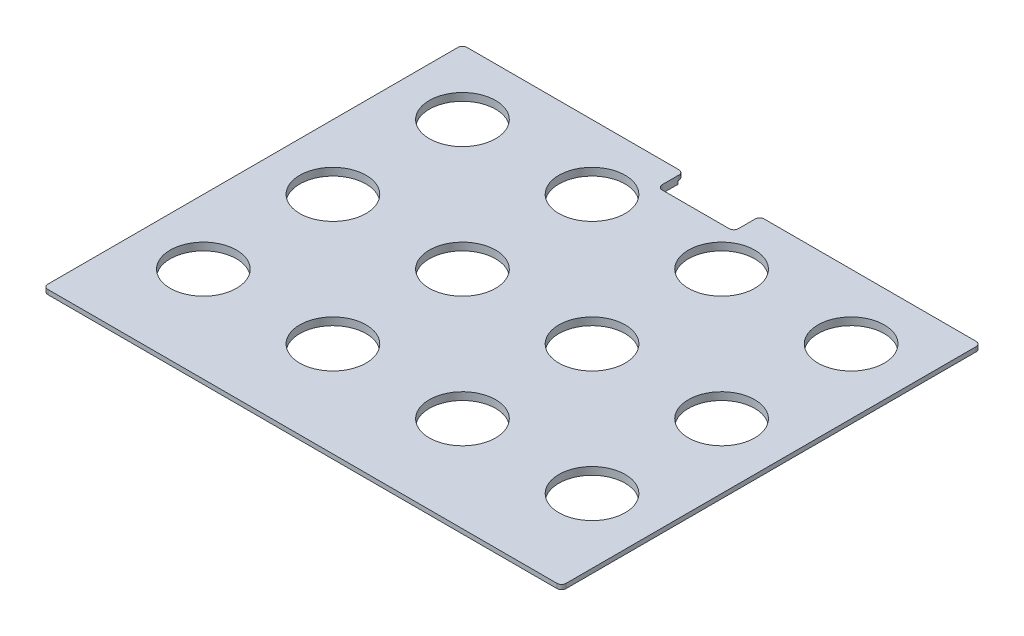
ISO-10303-21;
HEADER;
FILE_DESCRIPTION(('STEP AP214'),'2;1');
FILE_NAME('part.step','',(''),(''),'','','');
FILE_SCHEMA(('AUTOMOTIVE_DESIGN { 1 0 10303 214 1 1 1 1 }'));
ENDSEC;
DATA;
#1=APPLICATION_CONTEXT('core data for automotive mechanical design processes');
#2=APPLICATION_PROTOCOL_DEFINITION('international standard','automotive_design',2000,#1);
#3=PRODUCT_CONTEXT('',#1,'mechanical');
#4=PRODUCT('Part','Part','',(#3));
#5=PRODUCT_RELATED_PRODUCT_CATEGORY('part','',(#4));
#6=PRODUCT_DEFINITION_FORMATION('','',#4);
#7=PRODUCT_DEFINITION_CONTEXT('part definition',#1,'design');
#8=PRODUCT_DEFINITION('design','',#6,#7);
#9=PRODUCT_DEFINITION_SHAPE('','',#8);
#10=(LENGTH_UNIT() NAMED_UNIT(*) SI_UNIT(.MILLI.,.METRE.));
#11=(NAMED_UNIT(*) PLANE_ANGLE_UNIT() SI_UNIT($,.RADIAN.));
#12=(NAMED_UNIT(*) SI_UNIT($,.STERADIAN.) SOLID_ANGLE_UNIT());
#13=UNCERTAINTY_MEASURE_WITH_UNIT(LENGTH_MEASURE(1.E-05),#10,'distance_accuracy_value','');
#14=(GEOMETRIC_REPRESENTATION_CONTEXT(3) GLOBAL_UNCERTAINTY_ASSIGNED_CONTEXT((#13)) GLOBAL_UNIT_ASSIGNED_CONTEXT((#10,
#11,#12)) REPRESENTATION_CONTEXT('',''));
#15=CARTESIAN_POINT('',(0.,0.,0.));
#16=DIRECTION('',(0.,0.,1.));
#17=DIRECTION('',(1.,0.,0.));
#18=AXIS2_PLACEMENT_3D('',#15,#16,#17);
#19=CARTESIAN_POINT('',(170.,3.,-127.5));
#20=DIRECTION('',(0.,0.,1.));
#21=DIRECTION('',(1.,0.,0.));
#22=AXIS2_PLACEMENT_3D('',#19,#20,#21);
#23=PLANE('',#22);
#24=DIRECTION('',(-1.,0.,0.));
#25=VECTOR('',#24,1.);
#26=CARTESIAN_POINT('',(170.,3.,-127.5));
#27=LINE('',#26,#25);
#28=CARTESIAN_POINT('',(-28.,3.,-127.5));
#29=VERTEX_POINT('',#28);
#30=CARTESIAN_POINT('',(-167.,3.,-127.5));
#31=VERTEX_POINT('',#30);
#32=EDGE_CURVE('E304',#29,#31,#27,.T.);
#33=ORIENTED_EDGE('',*,*,#32,.F.);
#34=DIRECTION('',(0.,1.,0.));
#35=VECTOR('',#34,1.);
#36=CARTESIAN_POINT('',(-28.,3.,-127.5));
#37=LINE('',#36,#35);
#38=CARTESIAN_POINT('',(-28.,0.,-127.5));
#39=VERTEX_POINT('',#38);
#40=EDGE_CURVE('E387',#29,#39,#37,.F.);
#41=ORIENTED_EDGE('',*,*,#40,.T.);
#42=DIRECTION('',(-1.,0.,0.));
#43=VECTOR('',#42,1.);
#44=CARTESIAN_POINT('',(170.,0.,-127.5));
#45=LINE('',#44,#43);
#46=CARTESIAN_POINT('',(-167.,0.,-127.5));
#47=VERTEX_POINT('',#46);
#48=EDGE_CURVE('E315',#39,#47,#45,.T.);
#49=ORIENTED_EDGE('',*,*,#48,.T.);
#50=DIRECTION('',(0.,-1.,0.));
#51=VECTOR('',#50,1.);
#52=CARTESIAN_POINT('',(-167.,3.,-127.5));
#53=LINE('',#52,#51);
#54=EDGE_CURVE('E384',#47,#31,#53,.F.);
#55=ORIENTED_EDGE('',*,*,#54,.T.);
#56=EDGE_LOOP('',(#33,#41,#49,#55));
#57=FACE_BOUND('',#56,.T.);
#58=ADVANCED_FACE('F39',(#57),#23,.F.);
#59=CARTESIAN_POINT('',(166.5,-2.,-124.));
#60=DIRECTION('',(0.,0.,1.));
#61=DIRECTION('',(1.,0.,0.));
#62=AXIS2_PLACEMENT_3D('',#59,#60,#61);
#63=PLANE('',#62);
#64=DIRECTION('',(1.,0.,0.));
#65=VECTOR('',#64,1.);
#66=CARTESIAN_POINT('',(166.5,0.,-124.));
#67=LINE('',#66,#65);
#68=CARTESIAN_POINT('',(-166.5,0.,-124.));
#69=VERTEX_POINT('',#68);
#70=CARTESIAN_POINT('',(-25.,0.,-124.));
#71=VERTEX_POINT('',#70);
#72=EDGE_CURVE('E267',#69,#71,#67,.T.);
#73=ORIENTED_EDGE('',*,*,#72,.T.);
#74=DIRECTION('',(0.,-1.,0.));
#75=VECTOR('',#74,1.);
#76=CARTESIAN_POINT('',(-25.,-2.,-124.));
#77=LINE('',#76,#75);
#78=CARTESIAN_POINT('',(-25.,-2.,-124.));
#79=VERTEX_POINT('',#78);
#80=EDGE_CURVE('E508',#71,#79,#77,.T.);
#81=ORIENTED_EDGE('',*,*,#80,.T.);
#82=DIRECTION('',(1.,0.,0.));
#83=VECTOR('',#82,1.);
#84=CARTESIAN_POINT('',(166.5,-2.,-124.));
#85=LINE('',#84,#83);
#86=CARTESIAN_POINT('',(-166.5,-2.,-124.));
#87=VERTEX_POINT('',#86);
#88=EDGE_CURVE('E236',#87,#79,#85,.T.);
#89=ORIENTED_EDGE('',*,*,#88,.F.);
#90=DIRECTION('',(0.,1.,0.));
#91=VECTOR('',#90,1.);
#92=CARTESIAN_POINT('',(-166.5,-2.,-124.));
#93=LINE('',#92,#91);
#94=EDGE_CURVE('E274',#87,#69,#93,.T.);
#95=ORIENTED_EDGE('',*,*,#94,.T.);
#96=EDGE_LOOP('',(#73,#81,#89,#95));
#97=FACE_BOUND('',#96,.T.);
#98=ADVANCED_FACE('F534',(#97),#63,.F.);
#99=CARTESIAN_POINT('',(0.,0.,0.));
#100=DIRECTION('',(0.,1.,0.));
#101=DIRECTION('',(0.,0.,1.));
#102=AXIS2_PLACEMENT_3D('',#99,#100,#101);
#103=PLANE('',#102);
#104=DIRECTION('',(0.,0.,-1.));
#105=VECTOR('',#104,1.);
#106=CARTESIAN_POINT('',(25.,0.,0.));
#107=LINE('',#106,#105);
#108=CARTESIAN_POINT('',(25.,0.,-124.));
#109=VERTEX_POINT('',#108);
#110=CARTESIAN_POINT('',(25.,0.,-124.5));
#111=VERTEX_POINT('',#110);
#112=EDGE_CURVE('E225',#109,#111,#107,.T.);
#113=ORIENTED_EDGE('',*,*,#112,.T.);
#114=CARTESIAN_POINT('',(28.,0.,-124.5));
#115=DIRECTION('',(0.,1.,0.));
#116=DIRECTION('',(0.,0.,1.));
#117=AXIS2_PLACEMENT_3D('',#114,#115,#116);
#118=CIRCLE('',#117,3.);
#119=CARTESIAN_POINT('',(28.,0.,-127.5));
#120=VERTEX_POINT('',#119);
#121=EDGE_CURVE('E375',#111,#120,#118,.F.);
#122=ORIENTED_EDGE('',*,*,#121,.T.);
#123=CARTESIAN_POINT('',(167.,0.,-127.5));
#124=VERTEX_POINT('',#123);
#125=EDGE_CURVE('E300',#124,#120,#45,.T.);
#126=ORIENTED_EDGE('',*,*,#125,.F.);
#127=CARTESIAN_POINT('',(167.,0.,-124.5));
#128=DIRECTION('',(0.,1.,0.));
#129=DIRECTION('',(0.,0.,1.));
#130=AXIS2_PLACEMENT_3D('',#127,#128,#129);
#131=CIRCLE('',#130,3.);
#132=CARTESIAN_POINT('',(170.,0.,-124.5));
#133=VERTEX_POINT('',#132);
#134=EDGE_CURVE('E366',#124,#133,#131,.F.);
#135=ORIENTED_EDGE('',*,*,#134,.T.);
#136=DIRECTION('',(0.,0.,-1.));
#137=VECTOR('',#136,1.);
#138=CARTESIAN_POINT('',(170.,0.,127.5));
#139=LINE('',#138,#137);
#140=CARTESIAN_POINT('',(170.,0.,144.5));
#141=VERTEX_POINT('',#140);
#142=EDGE_CURVE('E311',#141,#133,#139,.T.);
#143=ORIENTED_EDGE('',*,*,#142,.F.);
#144=CARTESIAN_POINT('',(167.,0.,144.5));
#145=DIRECTION('',(0.,1.,0.));
#146=DIRECTION('',(0.,0.,1.));
#147=AXIS2_PLACEMENT_3D('',#144,#145,#146);
#148=CIRCLE('',#147,3.);
#149=CARTESIAN_POINT('',(167.,0.,147.5));
#150=VERTEX_POINT('',#149);
#151=EDGE_CURVE('E363',#141,#150,#148,.F.);
#152=ORIENTED_EDGE('',*,*,#151,.T.);
#153=DIRECTION('',(1.,0.,0.));
#154=VECTOR('',#153,1.);
#155=CARTESIAN_POINT('',(-170.,0.,147.5));
#156=LINE('',#155,#154);
#157=CARTESIAN_POINT('',(-167.,0.,147.5));
#158=VERTEX_POINT('',#157);
#159=EDGE_CURVE('E562',#158,#150,#156,.T.);
#160=ORIENTED_EDGE('',*,*,#159,.F.);
#161=CARTESIAN_POINT('',(-167.,0.,144.5));
#162=DIRECTION('',(0.,1.,0.));
#163=DIRECTION('',(0.,0.,1.));
#164=AXIS2_PLACEMENT_3D('',#161,#162,#163);
#165=CIRCLE('',#164,3.);
#166=CARTESIAN_POINT('',(-170.,0.,144.5));
#167=VERTEX_POINT('',#166);
#168=EDGE_CURVE('E63',#158,#167,#165,.F.);
#169=ORIENTED_EDGE('',*,*,#168,.T.);
#170=DIRECTION('',(0.,0.,1.));
#171=VECTOR('',#170,1.);
#172=CARTESIAN_POINT('',(-170.,0.,127.5));
#173=LINE('',#172,#171);
#174=CARTESIAN_POINT('',(-170.,0.,-124.5));
#175=VERTEX_POINT('',#174);
#176=EDGE_CURVE('E294',#175,#167,#173,.T.);
#177=ORIENTED_EDGE('',*,*,#176,.F.);
#178=CARTESIAN_POINT('',(-167.,0.,-124.5));
#179=DIRECTION('',(0.,1.,0.));
#180=DIRECTION('',(0.,0.,1.));
#181=AXIS2_PLACEMENT_3D('',#178,#179,#180);
#182=CIRCLE('',#181,3.);
#183=EDGE_CURVE('E369',#175,#47,#182,.F.);
#184=ORIENTED_EDGE('',*,*,#183,.T.);
#185=ORIENTED_EDGE('',*,*,#48,.F.);
#186=CARTESIAN_POINT('',(-28.,0.,-124.5));
#187=DIRECTION('',(0.,1.,0.));
#188=DIRECTION('',(0.,0.,1.));
#189=AXIS2_PLACEMENT_3D('',#186,#187,#188);
#190=CIRCLE('',#189,3.);
#191=CARTESIAN_POINT('',(-25.,0.,-124.5));
#192=VERTEX_POINT('',#191);
#193=EDGE_CURVE('E372',#39,#192,#190,.F.);
#194=ORIENTED_EDGE('',*,*,#193,.T.);
#195=DIRECTION('',(0.,0.,1.));
#196=VECTOR('',#195,1.);
#197=CARTESIAN_POINT('',(-25.,0.,0.));
#198=LINE('',#197,#196);
#199=EDGE_CURVE('E250',#192,#71,#198,.T.);
#200=ORIENTED_EDGE('',*,*,#199,.T.);
#201=ORIENTED_EDGE('',*,*,#72,.F.);
#202=DIRECTION('',(0.,0.,-1.));
#203=VECTOR('',#202,1.);
#204=CARTESIAN_POINT('',(-166.5,0.,100.5));
#205=LINE('',#204,#203);
#206=CARTESIAN_POINT('',(-166.5,0.,100.5));
#207=VERTEX_POINT('',#206);
#208=EDGE_CURVE('E262',#207,#69,#205,.T.);
#209=ORIENTED_EDGE('',*,*,#208,.F.);
#210=DIRECTION('',(-0.707106781186547,0.,-0.707106781186548));
#211=VECTOR('',#210,1.);
#212=CARTESIAN_POINT('',(-166.5,0.,100.5));
#213=LINE('',#212,#211);
#214=CARTESIAN_POINT('',(-143.,0.,124.));
#215=VERTEX_POINT('',#214);
#216=EDGE_CURVE('E258',#215,#207,#213,.T.);
#217=ORIENTED_EDGE('',*,*,#216,.F.);
#218=DIRECTION('',(-1.,0.,0.));
#219=VECTOR('',#218,1.);
#220=CARTESIAN_POINT('',(-143.,0.,124.));
#221=LINE('',#220,#219);
#222=CARTESIAN_POINT('',(143.,0.,124.));
#223=VERTEX_POINT('',#222);
#224=EDGE_CURVE('E254',#223,#215,#221,.T.);
#225=ORIENTED_EDGE('',*,*,#224,.F.);
#226=DIRECTION('',(-0.707106781186547,0.,0.707106781186548));
#227=VECTOR('',#226,1.);
#228=CARTESIAN_POINT('',(143.,0.,124.));
#229=LINE('',#228,#227);
#230=CARTESIAN_POINT('',(166.5,0.,100.5));
#231=VERTEX_POINT('',#230);
#232=EDGE_CURVE('E249',#231,#223,#229,.T.);
#233=ORIENTED_EDGE('',*,*,#232,.F.);
#234=DIRECTION('',(0.,0.,1.));
#235=VECTOR('',#234,1.);
#236=CARTESIAN_POINT('',(166.5,0.,100.5));
#237=LINE('',#236,#235);
#238=CARTESIAN_POINT('',(166.5,0.,-124.));
#239=VERTEX_POINT('',#238);
#240=EDGE_CURVE('E245',#239,#231,#237,.T.);
#241=ORIENTED_EDGE('',*,*,#240,.F.);
#242=EDGE_CURVE('E266',#109,#239,#67,.T.);
#243=ORIENTED_EDGE('',*,*,#242,.F.);
#244=EDGE_LOOP('',(#113,#122,#126,#135,#143,#152,#160,#169,#177,#184,#185,#194,#200,#201,#209,
#217,#225,#233,#241,#243));
#245=FACE_BOUND('',#244,.T.);
#246=ADVANCED_FACE('F652',(#245),#103,.F.);
#247=CARTESIAN_POINT('',(-170.,3.,127.5));
#248=DIRECTION('',(1.,0.,0.));
#249=DIRECTION('',(0.,0.,-1.));
#250=AXIS2_PLACEMENT_3D('',#247,#248,#249);
#251=PLANE('',#250);
#252=DIRECTION('',(0.,0.,1.));
#253=VECTOR('',#252,1.);
#254=CARTESIAN_POINT('',(-170.,3.,127.5));
#255=LINE('',#254,#253);
#256=CARTESIAN_POINT('',(-170.,3.,-124.5));
#257=VERTEX_POINT('',#256);
#258=CARTESIAN_POINT('',(-170.,3.,144.5));
#259=VERTEX_POINT('',#258);
#260=EDGE_CURVE('E295',#257,#259,#255,.T.);
#261=ORIENTED_EDGE('',*,*,#260,.F.);
#262=DIRECTION('',(0.,-1.,0.));
#263=VECTOR('',#262,1.);
#264=CARTESIAN_POINT('',(-170.,3.,-124.5));
#265=LINE('',#264,#263);
#266=EDGE_CURVE('E394',#257,#175,#265,.T.);
#267=ORIENTED_EDGE('',*,*,#266,.T.);
#268=ORIENTED_EDGE('',*,*,#176,.T.);
#269=DIRECTION('',(0.,1.,0.));
#270=VECTOR('',#269,1.);
#271=CARTESIAN_POINT('',(-170.,3.,144.5));
#272=LINE('',#271,#270);
#273=EDGE_CURVE('E390',#167,#259,#272,.T.);
#274=ORIENTED_EDGE('',*,*,#273,.T.);
#275=EDGE_LOOP('',(#261,#267,#268,#274));
#276=FACE_BOUND('',#275,.T.);
#277=ADVANCED_FACE('F550',(#276),#251,.F.);
#278=CARTESIAN_POINT('',(170.,3.,127.5));
#279=DIRECTION('',(-1.,0.,0.));
#280=DIRECTION('',(0.,0.,1.));
#281=AXIS2_PLACEMENT_3D('',#278,#279,#280);
#282=PLANE('',#281);
#283=ORIENTED_EDGE('',*,*,#142,.T.);
#284=DIRECTION('',(0.,-1.,0.));
#285=VECTOR('',#284,1.);
#286=CARTESIAN_POINT('',(170.,3.,-124.5));
#287=LINE('',#286,#285);
#288=CARTESIAN_POINT('',(170.,3.,-124.5));
#289=VERTEX_POINT('',#288);
#290=EDGE_CURVE('E401',#133,#289,#287,.F.);
#291=ORIENTED_EDGE('',*,*,#290,.T.);
#292=DIRECTION('',(0.,0.,-1.));
#293=VECTOR('',#292,1.);
#294=CARTESIAN_POINT('',(170.,3.,127.5));
#295=LINE('',#294,#293);
#296=CARTESIAN_POINT('',(170.,3.,144.5));
#297=VERTEX_POINT('',#296);
#298=EDGE_CURVE('E299',#297,#289,#295,.T.);
#299=ORIENTED_EDGE('',*,*,#298,.F.);
#300=DIRECTION('',(0.,1.,0.));
#301=VECTOR('',#300,1.);
#302=CARTESIAN_POINT('',(170.,0.,144.5));
#303=LINE('',#302,#301);
#304=EDGE_CURVE('E398',#297,#141,#303,.F.);
#305=ORIENTED_EDGE('',*,*,#304,.T.);
#306=EDGE_LOOP('',(#283,#291,#299,#305));
#307=FACE_BOUND('',#306,.T.);
#308=ADVANCED_FACE('F657',(#307),#282,.F.);
#309=ORIENTED_EDGE('',*,*,#125,.T.);
#310=DIRECTION('',(0.,1.,0.));
#311=VECTOR('',#310,1.);
#312=CARTESIAN_POINT('',(28.,3.,-127.5));
#313=LINE('',#312,#311);
#314=CARTESIAN_POINT('',(28.,3.,-127.5));
#315=VERTEX_POINT('',#314);
#316=EDGE_CURVE('E339',#120,#315,#313,.T.);
#317=ORIENTED_EDGE('',*,*,#316,.T.);
#318=CARTESIAN_POINT('',(167.,3.,-127.5));
#319=VERTEX_POINT('',#318);
#320=EDGE_CURVE('E308',#319,#315,#27,.T.);
#321=ORIENTED_EDGE('',*,*,#320,.F.);
#322=DIRECTION('',(0.,-1.,0.));
#323=VECTOR('',#322,1.);
#324=CARTESIAN_POINT('',(167.,3.,-127.5));
#325=LINE('',#324,#323);
#326=EDGE_CURVE('E335',#319,#124,#325,.T.);
#327=ORIENTED_EDGE('',*,*,#326,.T.);
#328=EDGE_LOOP('',(#309,#317,#321,#327));
#329=FACE_BOUND('',#328,.T.);
#330=ADVANCED_FACE('F608',(#329),#23,.F.);
#331=CARTESIAN_POINT('',(0.,3.,0.));
#332=DIRECTION('',(0.,1.,0.));
#333=DIRECTION('',(0.,0.,1.));
#334=AXIS2_PLACEMENT_3D('',#331,#332,#333);
#335=PLANE('',#334);
#336=ORIENTED_EDGE('',*,*,#320,.T.);
#337=CARTESIAN_POINT('',(28.,3.,-124.5));
#338=DIRECTION('',(0.,1.,0.));
#339=DIRECTION('',(0.,0.,1.));
#340=AXIS2_PLACEMENT_3D('',#337,#338,#339);
#341=CIRCLE('',#340,3.);
#342=CARTESIAN_POINT('',(25.,3.,-124.5));
#343=VERTEX_POINT('',#342);
#344=EDGE_CURVE('E358',#315,#343,#341,.T.);
#345=ORIENTED_EDGE('',*,*,#344,.T.);
#346=DIRECTION('',(0.,0.,-1.));
#347=VECTOR('',#346,1.);
#348=CARTESIAN_POINT('',(25.,3.,-127.5));
#349=LINE('',#348,#347);
#350=CARTESIAN_POINT('',(25.,3.,-113.5));
#351=VERTEX_POINT('',#350);
#352=EDGE_CURVE('E440',#351,#343,#349,.T.);
#353=ORIENTED_EDGE('',*,*,#352,.F.);
#354=CARTESIAN_POINT('',(22.,3.,-113.5));
#355=DIRECTION('',(0.,1.,0.));
#356=DIRECTION('',(0.,0.,1.));
#357=AXIS2_PLACEMENT_3D('',#354,#355,#356);
#358=CIRCLE('',#357,3.);
#359=CARTESIAN_POINT('',(22.,3.,-110.5));
#360=VERTEX_POINT('',#359);
#361=EDGE_CURVE('E411',#351,#360,#358,.F.);
#362=ORIENTED_EDGE('',*,*,#361,.T.);
#363=DIRECTION('',(1.,0.,0.));
#364=VECTOR('',#363,1.);
#365=CARTESIAN_POINT('',(-25.,3.,-110.5));
#366=LINE('',#365,#364);
#367=CARTESIAN_POINT('',(-22.,3.,-110.5));
#368=VERTEX_POINT('',#367);
#369=EDGE_CURVE('E424',#368,#360,#366,.T.);
#370=ORIENTED_EDGE('',*,*,#369,.F.);
#371=CARTESIAN_POINT('',(-22.,3.,-113.5));
#372=DIRECTION('',(0.,1.,0.));
#373=DIRECTION('',(0.,0.,1.));
#374=AXIS2_PLACEMENT_3D('',#371,#372,#373);
#375=CIRCLE('',#374,3.);
#376=CARTESIAN_POINT('',(-25.,3.,-113.5));
#377=VERTEX_POINT('',#376);
#378=EDGE_CURVE('E48',#368,#377,#375,.F.);
#379=ORIENTED_EDGE('',*,*,#378,.T.);
#380=DIRECTION('',(0.,0.,1.));
#381=VECTOR('',#380,1.);
#382=CARTESIAN_POINT('',(-25.,3.,-127.5));
#383=LINE('',#382,#381);
#384=CARTESIAN_POINT('',(-25.,3.,-124.5));
#385=VERTEX_POINT('',#384);
#386=EDGE_CURVE('E422',#385,#377,#383,.T.);
#387=ORIENTED_EDGE('',*,*,#386,.F.);
#388=CARTESIAN_POINT('',(-28.,3.,-124.5));
#389=DIRECTION('',(0.,1.,0.));
#390=DIRECTION('',(0.,0.,1.));
#391=AXIS2_PLACEMENT_3D('',#388,#389,#390);
#392=CIRCLE('',#391,3.);
#393=EDGE_CURVE('E355',#385,#29,#392,.T.);
#394=ORIENTED_EDGE('',*,*,#393,.T.);
#395=ORIENTED_EDGE('',*,*,#32,.T.);
#396=CARTESIAN_POINT('',(-167.,3.,-124.5));
#397=DIRECTION('',(0.,1.,0.));
#398=DIRECTION('',(0.,0.,1.));
#399=AXIS2_PLACEMENT_3D('',#396,#397,#398);
#400=CIRCLE('',#399,3.);
#401=EDGE_CURVE('E352',#31,#257,#400,.T.);
#402=ORIENTED_EDGE('',*,*,#401,.T.);
#403=ORIENTED_EDGE('',*,*,#260,.T.);
#404=CARTESIAN_POINT('',(-167.,3.,144.5));
#405=DIRECTION('',(0.,1.,0.));
#406=DIRECTION('',(0.,0.,1.));
#407=AXIS2_PLACEMENT_3D('',#404,#405,#406);
#408=CIRCLE('',#407,3.);
#409=CARTESIAN_POINT('',(-167.,3.,147.5));
#410=VERTEX_POINT('',#409);
#411=EDGE_CURVE('E343',#259,#410,#408,.T.);
#412=ORIENTED_EDGE('',*,*,#411,.T.);
#413=DIRECTION('',(1.,0.,0.));
#414=VECTOR('',#413,1.);
#415=CARTESIAN_POINT('',(-170.,3.,147.5));
#416=LINE('',#415,#414);
#417=CARTESIAN_POINT('',(167.,3.,147.5));
#418=VERTEX_POINT('',#417);
#419=EDGE_CURVE('E556',#410,#418,#416,.T.);
#420=ORIENTED_EDGE('',*,*,#419,.T.);
#421=CARTESIAN_POINT('',(167.,3.,144.5));
#422=DIRECTION('',(0.,1.,0.));
#423=DIRECTION('',(0.,0.,1.));
#424=AXIS2_PLACEMENT_3D('',#421,#422,#423);
#425=CIRCLE('',#424,3.);
#426=EDGE_CURVE('E346',#418,#297,#425,.T.);
#427=ORIENTED_EDGE('',*,*,#426,.T.);
#428=ORIENTED_EDGE('',*,*,#298,.T.);
#429=CARTESIAN_POINT('',(167.,3.,-124.5));
#430=DIRECTION('',(0.,1.,0.));
#431=DIRECTION('',(0.,0.,1.));
#432=AXIS2_PLACEMENT_3D('',#429,#430,#431);
#433=CIRCLE('',#432,3.);
#434=EDGE_CURVE('E349',#289,#319,#433,.T.);
#435=ORIENTED_EDGE('',*,*,#434,.T.);
#436=EDGE_LOOP('',(#336,#345,#353,#362,#370,#379,#387,#394,#395,#402,#403,#412,#420,#427,#428,#435));
#437=FACE_BOUND('',#436,.T.);
#438=CARTESIAN_POINT('',(-42.5,3.,0.));
#439=DIRECTION('',(0.,1.,0.));
#440=DIRECTION('',(0.,0.,1.));
#441=AXIS2_PLACEMENT_3D('',#438,#439,#440);
#442=CIRCLE('',#441,21.75);
#443=CARTESIAN_POINT('',(-42.5,3.,21.75));
#444=VERTEX_POINT('',#443);
#445=EDGE_CURVE('E218',#444,#444,#442,.T.);
#446=ORIENTED_EDGE('',*,*,#445,.F.);
#447=EDGE_LOOP('',(#446));
#448=FACE_BOUND('',#447,.T.);
#449=CARTESIAN_POINT('',(-127.5,3.,0.));
#450=DIRECTION('',(0.,1.,0.));
#451=DIRECTION('',(0.,0.,1.));
#452=AXIS2_PLACEMENT_3D('',#449,#450,#451);
#453=CIRCLE('',#452,21.75);
#454=CARTESIAN_POINT('',(-127.5,3.,21.75));
#455=VERTEX_POINT('',#454);
#456=EDGE_CURVE('E463',#455,#455,#453,.T.);
#457=ORIENTED_EDGE('',*,*,#456,.F.);
#458=EDGE_LOOP('',(#457));
#459=FACE_BOUND('',#458,.T.);
#460=CARTESIAN_POINT('',(-42.5,3.,-85.));
#461=DIRECTION('',(0.,1.,0.));
#462=DIRECTION('',(0.,0.,1.));
#463=AXIS2_PLACEMENT_3D('',#460,#461,#462);
#464=CIRCLE('',#463,21.75);
#465=CARTESIAN_POINT('',(-42.5,3.,-63.25));
#466=VERTEX_POINT('',#465);
#467=EDGE_CURVE('E455',#466,#466,#464,.T.);
#468=ORIENTED_EDGE('',*,*,#467,.F.);
#469=EDGE_LOOP('',(#468));
#470=FACE_BOUND('',#469,.T.);
#471=CARTESIAN_POINT('',(-127.5,3.,85.));
#472=DIRECTION('',(0.,1.,0.));
#473=DIRECTION('',(0.,0.,1.));
#474=AXIS2_PLACEMENT_3D('',#471,#472,#473);
#475=CIRCLE('',#474,21.75);
#476=CARTESIAN_POINT('',(-127.5,3.,106.75));
#477=VERTEX_POINT('',#476);
#478=EDGE_CURVE('E471',#477,#477,#475,.T.);
#479=ORIENTED_EDGE('',*,*,#478,.F.);
#480=EDGE_LOOP('',(#479));
#481=FACE_BOUND('',#480,.T.);
#482=CARTESIAN_POINT('',(-42.5,3.,85.));
#483=DIRECTION('',(0.,1.,0.));
#484=DIRECTION('',(0.,0.,1.));
#485=AXIS2_PLACEMENT_3D('',#482,#483,#484);
#486=CIRCLE('',#485,21.75);
#487=CARTESIAN_POINT('',(-42.5,3.,106.75));
#488=VERTEX_POINT('',#487);
#489=EDGE_CURVE('E479',#488,#488,#486,.T.);
#490=ORIENTED_EDGE('',*,*,#489,.F.);
#491=EDGE_LOOP('',(#490));
#492=FACE_BOUND('',#491,.T.);
#493=CARTESIAN_POINT('',(127.5,3.,85.));
#494=DIRECTION('',(0.,1.,0.));
#495=DIRECTION('',(0.,0.,-1.));
#496=AXIS2_PLACEMENT_3D('',#493,#494,#495);
#497=CIRCLE('',#496,21.75);
#498=CARTESIAN_POINT('',(127.5,3.,63.25));
#499=VERTEX_POINT('',#498);
#500=EDGE_CURVE('E487',#499,#499,#497,.T.);
#501=ORIENTED_EDGE('',*,*,#500,.F.);
#502=EDGE_LOOP('',(#501));
#503=FACE_BOUND('',#502,.T.);
#504=CARTESIAN_POINT('',(42.5,3.,85.));
#505=DIRECTION('',(0.,1.,0.));
#506=DIRECTION('',(0.,0.,-1.));
#507=AXIS2_PLACEMENT_3D('',#504,#505,#506);
#508=CIRCLE('',#507,21.75);
#509=CARTESIAN_POINT('',(42.5,3.,63.25));
#510=VERTEX_POINT('',#509);
#511=EDGE_CURVE('E495',#510,#510,#508,.T.);
#512=ORIENTED_EDGE('',*,*,#511,.F.);
#513=EDGE_LOOP('',(#512));
#514=FACE_BOUND('',#513,.T.);
#515=CARTESIAN_POINT('',(42.5,3.,0.));
#516=DIRECTION('',(0.,1.,0.));
#517=DIRECTION('',(0.,0.,-1.));
#518=AXIS2_PLACEMENT_3D('',#515,#516,#517);
#519=CIRCLE('',#518,21.75);
#520=CARTESIAN_POINT('',(42.5,3.,-21.75));
#521=VERTEX_POINT('',#520);
#522=EDGE_CURVE('E571',#521,#521,#519,.T.);
#523=ORIENTED_EDGE('',*,*,#522,.F.);
#524=EDGE_LOOP('',(#523));
#525=FACE_BOUND('',#524,.T.);
#526=CARTESIAN_POINT('',(127.5,3.,0.));
#527=DIRECTION('',(0.,1.,0.));
#528=DIRECTION('',(0.,0.,-1.));
#529=AXIS2_PLACEMENT_3D('',#526,#527,#528);
#530=CIRCLE('',#529,21.75);
#531=CARTESIAN_POINT('',(127.5,3.,-21.75));
#532=VERTEX_POINT('',#531);
#533=EDGE_CURVE('E579',#532,#532,#530,.T.);
#534=ORIENTED_EDGE('',*,*,#533,.F.);
#535=EDGE_LOOP('',(#534));
#536=FACE_BOUND('',#535,.T.);
#537=CARTESIAN_POINT('',(127.5,3.,-85.));
#538=DIRECTION('',(0.,1.,0.));
#539=DIRECTION('',(0.,0.,-1.));
#540=AXIS2_PLACEMENT_3D('',#537,#538,#539);
#541=CIRCLE('',#540,21.75);
#542=CARTESIAN_POINT('',(127.5,3.,-106.75));
#543=VERTEX_POINT('',#542);
#544=EDGE_CURVE('E587',#543,#543,#541,.T.);
#545=ORIENTED_EDGE('',*,*,#544,.F.);
#546=EDGE_LOOP('',(#545));
#547=FACE_BOUND('',#546,.T.);
#548=CARTESIAN_POINT('',(42.5,3.,-85.));
#549=DIRECTION('',(0.,1.,0.));
#550=DIRECTION('',(0.,0.,-1.));
#551=AXIS2_PLACEMENT_3D('',#548,#549,#550);
#552=CIRCLE('',#551,21.75);
#553=CARTESIAN_POINT('',(42.5,3.,-106.75));
#554=VERTEX_POINT('',#553);
#555=EDGE_CURVE('E565',#554,#554,#552,.T.);
#556=ORIENTED_EDGE('',*,*,#555,.F.);
#557=EDGE_LOOP('',(#556));
#558=FACE_BOUND('',#557,.T.);
#559=CARTESIAN_POINT('',(-127.5,3.,-85.));
#560=DIRECTION('',(0.,1.,0.));
#561=DIRECTION('',(0.,0.,1.));
#562=AXIS2_PLACEMENT_3D('',#559,#560,#561);
#563=CIRCLE('',#562,21.75);
#564=CARTESIAN_POINT('',(-127.5,3.,-63.25));
#565=VERTEX_POINT('',#564);
#566=EDGE_CURVE('E454',#565,#565,#563,.T.);
#567=ORIENTED_EDGE('',*,*,#566,.F.);
#568=EDGE_LOOP('',(#567));
#569=FACE_BOUND('',#568,.T.);
#570=ADVANCED_FACE('F420',(#437,#448,#459,#470,#481,#492,#503,#514,#525,#536,#547,#558,#569),
#335,.T.);
#571=CARTESIAN_POINT('',(166.5,-2.,100.5));
#572=DIRECTION('',(-1.,0.,0.));
#573=DIRECTION('',(0.,0.,1.));
#574=AXIS2_PLACEMENT_3D('',#571,#572,#573);
#575=PLANE('',#574);
#576=ORIENTED_EDGE('',*,*,#240,.T.);
#577=DIRECTION('',(0.,1.,0.));
#578=VECTOR('',#577,1.);
#579=CARTESIAN_POINT('',(166.5,-2.,100.5));
#580=LINE('',#579,#578);
#581=CARTESIAN_POINT('',(166.5,-2.,100.5));
#582=VERTEX_POINT('',#581);
#583=EDGE_CURVE('E290',#582,#231,#580,.T.);
#584=ORIENTED_EDGE('',*,*,#583,.F.);
#585=DIRECTION('',(0.,0.,1.));
#586=VECTOR('',#585,1.);
#587=CARTESIAN_POINT('',(166.5,-2.,100.5));
#588=LINE('',#587,#586);
#589=CARTESIAN_POINT('',(166.5,-2.,-124.));
#590=VERTEX_POINT('',#589);
#591=EDGE_CURVE('E271',#590,#582,#588,.T.);
#592=ORIENTED_EDGE('',*,*,#591,.F.);
#593=DIRECTION('',(0.,1.,0.));
#594=VECTOR('',#593,1.);
#595=CARTESIAN_POINT('',(166.5,-2.,-124.));
#596=LINE('',#595,#594);
#597=EDGE_CURVE('E233',#590,#239,#596,.T.);
#598=ORIENTED_EDGE('',*,*,#597,.T.);
#599=EDGE_LOOP('',(#576,#584,#592,#598));
#600=FACE_BOUND('',#599,.T.);
#601=ADVANCED_FACE('F607',(#600),#575,.F.);
#602=CARTESIAN_POINT('',(143.,-2.,124.));
#603=DIRECTION('',(-0.707106781186548,0.,-0.707106781186547));
#604=DIRECTION('',(-0.707106781186547,0.,0.707106781186548));
#605=AXIS2_PLACEMENT_3D('',#602,#603,#604);
#606=PLANE('',#605);
#607=ORIENTED_EDGE('',*,*,#232,.T.);
#608=DIRECTION('',(0.,1.,0.));
#609=VECTOR('',#608,1.);
#610=CARTESIAN_POINT('',(143.,-2.,124.));
#611=LINE('',#610,#609);
#612=CARTESIAN_POINT('',(143.,-2.,124.));
#613=VERTEX_POINT('',#612);
#614=EDGE_CURVE('E286',#613,#223,#611,.T.);
#615=ORIENTED_EDGE('',*,*,#614,.F.);
#616=DIRECTION('',(-0.707106781186547,0.,0.707106781186548));
#617=VECTOR('',#616,1.);
#618=CARTESIAN_POINT('',(143.,-2.,124.));
#619=LINE('',#618,#617);
#620=EDGE_CURVE('E516',#582,#613,#619,.T.);
#621=ORIENTED_EDGE('',*,*,#620,.F.);
#622=ORIENTED_EDGE('',*,*,#583,.T.);
#623=EDGE_LOOP('',(#607,#615,#621,#622));
#624=FACE_BOUND('',#623,.T.);
#625=ADVANCED_FACE('F715',(#624),#606,.F.);
#626=CARTESIAN_POINT('',(-143.,-2.,124.));
#627=DIRECTION('',(0.,0.,-1.));
#628=DIRECTION('',(-1.,0.,0.));
#629=AXIS2_PLACEMENT_3D('',#626,#627,#628);
#630=PLANE('',#629);
#631=ORIENTED_EDGE('',*,*,#224,.T.);
#632=DIRECTION('',(0.,1.,0.));
#633=VECTOR('',#632,1.);
#634=CARTESIAN_POINT('',(-143.,-2.,124.));
#635=LINE('',#634,#633);
#636=CARTESIAN_POINT('',(-143.,-2.,124.));
#637=VERTEX_POINT('',#636);
#638=EDGE_CURVE('E282',#637,#215,#635,.T.);
#639=ORIENTED_EDGE('',*,*,#638,.F.);
#640=DIRECTION('',(-1.,0.,0.));
#641=VECTOR('',#640,1.);
#642=CARTESIAN_POINT('',(-143.,-2.,124.));
#643=LINE('',#642,#641);
#644=EDGE_CURVE('E519',#613,#637,#643,.T.);
#645=ORIENTED_EDGE('',*,*,#644,.F.);
#646=ORIENTED_EDGE('',*,*,#614,.T.);
#647=EDGE_LOOP('',(#631,#639,#645,#646));
#648=FACE_BOUND('',#647,.T.);
#649=ADVANCED_FACE('F719',(#648),#630,.F.);
#650=CARTESIAN_POINT('',(-166.5,-2.,100.5));
#651=DIRECTION('',(0.707106781186548,0.,-0.707106781186547));
#652=DIRECTION('',(-0.707106781186547,0.,-0.707106781186548));
#653=AXIS2_PLACEMENT_3D('',#650,#651,#652);
#654=PLANE('',#653);
#655=ORIENTED_EDGE('',*,*,#216,.T.);
#656=DIRECTION('',(0.,1.,0.));
#657=VECTOR('',#656,1.);
#658=CARTESIAN_POINT('',(-166.5,-2.,100.5));
#659=LINE('',#658,#657);
#660=CARTESIAN_POINT('',(-166.5,-2.,100.5));
#661=VERTEX_POINT('',#660);
#662=EDGE_CURVE('E278',#661,#207,#659,.T.);
#663=ORIENTED_EDGE('',*,*,#662,.F.);
#664=DIRECTION('',(-0.707106781186547,0.,-0.707106781186548));
#665=VECTOR('',#664,1.);
#666=CARTESIAN_POINT('',(-166.5,-2.,100.5));
#667=LINE('',#666,#665);
#668=EDGE_CURVE('E241',#637,#661,#667,.T.);
#669=ORIENTED_EDGE('',*,*,#668,.F.);
#670=ORIENTED_EDGE('',*,*,#638,.T.);
#671=EDGE_LOOP('',(#655,#663,#669,#670));
#672=FACE_BOUND('',#671,.T.);
#673=ADVANCED_FACE('F529',(#672),#654,.F.);
#674=CARTESIAN_POINT('',(-166.5,-2.,100.5));
#675=DIRECTION('',(1.,0.,0.));
#676=DIRECTION('',(0.,0.,-1.));
#677=AXIS2_PLACEMENT_3D('',#674,#675,#676);
#678=PLANE('',#677);
#679=ORIENTED_EDGE('',*,*,#208,.T.);
#680=ORIENTED_EDGE('',*,*,#94,.F.);
#681=DIRECTION('',(0.,0.,-1.));
#682=VECTOR('',#681,1.);
#683=CARTESIAN_POINT('',(-166.5,-2.,100.5));
#684=LINE('',#683,#682);
#685=EDGE_CURVE('E237',#661,#87,#684,.T.);
#686=ORIENTED_EDGE('',*,*,#685,.F.);
#687=ORIENTED_EDGE('',*,*,#662,.T.);
#688=EDGE_LOOP('',(#679,#680,#686,#687));
#689=FACE_BOUND('',#688,.T.);
#690=ADVANCED_FACE('F531',(#689),#678,.F.);
#691=CARTESIAN_POINT('',(25.,-2.,-124.));
#692=VERTEX_POINT('',#691);
#693=EDGE_CURVE('E209',#692,#590,#85,.T.);
#694=ORIENTED_EDGE('',*,*,#693,.F.);
#695=DIRECTION('',(0.,1.,0.));
#696=VECTOR('',#695,1.);
#697=CARTESIAN_POINT('',(25.,-2.,-124.));
#698=LINE('',#697,#696);
#699=EDGE_CURVE('E222',#692,#109,#698,.T.);
#700=ORIENTED_EDGE('',*,*,#699,.T.);
#701=ORIENTED_EDGE('',*,*,#242,.T.);
#702=ORIENTED_EDGE('',*,*,#597,.F.);
#703=EDGE_LOOP('',(#694,#700,#701,#702));
#704=FACE_BOUND('',#703,.T.);
#705=ADVANCED_FACE('F231',(#704),#63,.F.);
#706=CARTESIAN_POINT('',(0.,-2.,0.));
#707=DIRECTION('',(0.,1.,0.));
#708=DIRECTION('',(0.,0.,1.));
#709=AXIS2_PLACEMENT_3D('',#706,#707,#708);
#710=PLANE('',#709);
#711=ORIENTED_EDGE('',*,*,#88,.T.);
#712=DIRECTION('',(0.,0.,1.));
#713=VECTOR('',#712,1.);
#714=CARTESIAN_POINT('',(-25.,-2.,0.));
#715=LINE('',#714,#713);
#716=CARTESIAN_POINT('',(-25.,-2.,-113.5));
#717=VERTEX_POINT('',#716);
#718=EDGE_CURVE('E319',#79,#717,#715,.T.);
#719=ORIENTED_EDGE('',*,*,#718,.T.);
#720=CARTESIAN_POINT('',(-22.,-2.,-113.5));
#721=DIRECTION('',(0.,1.,0.));
#722=DIRECTION('',(0.,0.,1.));
#723=AXIS2_PLACEMENT_3D('',#720,#721,#722);
#724=CIRCLE('',#723,3.);
#725=CARTESIAN_POINT('',(-22.,-2.,-110.5));
#726=VERTEX_POINT('',#725);
#727=EDGE_CURVE('E11',#717,#726,#724,.T.);
#728=ORIENTED_EDGE('',*,*,#727,.T.);
#729=DIRECTION('',(1.,0.,0.));
#730=VECTOR('',#729,1.);
#731=CARTESIAN_POINT('',(-25.,-2.,-110.5));
#732=LINE('',#731,#730);
#733=CARTESIAN_POINT('',(22.,-2.,-110.5));
#734=VERTEX_POINT('',#733);
#735=EDGE_CURVE('E219',#726,#734,#732,.T.);
#736=ORIENTED_EDGE('',*,*,#735,.T.);
#737=CARTESIAN_POINT('',(22.,-2.,-113.5));
#738=DIRECTION('',(0.,1.,0.));
#739=DIRECTION('',(0.,0.,1.));
#740=AXIS2_PLACEMENT_3D('',#737,#738,#739);
#741=CIRCLE('',#740,3.);
#742=CARTESIAN_POINT('',(25.,-2.,-113.5));
#743=VERTEX_POINT('',#742);
#744=EDGE_CURVE('E213',#734,#743,#741,.T.);
#745=ORIENTED_EDGE('',*,*,#744,.T.);
#746=DIRECTION('',(0.,0.,-1.));
#747=VECTOR('',#746,1.);
#748=CARTESIAN_POINT('',(25.,-2.,-127.5));
#749=LINE('',#748,#747);
#750=EDGE_CURVE('E202',#743,#692,#749,.T.);
#751=ORIENTED_EDGE('',*,*,#750,.T.);
#752=ORIENTED_EDGE('',*,*,#693,.T.);
#753=ORIENTED_EDGE('',*,*,#591,.T.);
#754=ORIENTED_EDGE('',*,*,#620,.T.);
#755=ORIENTED_EDGE('',*,*,#644,.T.);
#756=ORIENTED_EDGE('',*,*,#668,.T.);
#757=ORIENTED_EDGE('',*,*,#685,.T.);
#758=EDGE_LOOP('',(#711,#719,#728,#736,#745,#751,#752,#753,#754,#755,#756,#757));
#759=FACE_BOUND('',#758,.T.);
#760=CARTESIAN_POINT('',(-42.5,-2.,0.));
#761=DIRECTION('',(0.,1.,0.));
#762=DIRECTION('',(0.,0.,1.));
#763=AXIS2_PLACEMENT_3D('',#760,#761,#762);
#764=CIRCLE('',#763,21.75);
#765=CARTESIAN_POINT('',(-42.5,-2.,21.75));
#766=VERTEX_POINT('',#765);
#767=EDGE_CURVE('E467',#766,#766,#764,.T.);
#768=ORIENTED_EDGE('',*,*,#767,.T.);
#769=EDGE_LOOP('',(#768));
#770=FACE_BOUND('',#769,.T.);
#771=CARTESIAN_POINT('',(-127.5,-2.,0.));
#772=DIRECTION('',(0.,1.,0.));
#773=DIRECTION('',(0.,0.,1.));
#774=AXIS2_PLACEMENT_3D('',#771,#772,#773);
#775=CIRCLE('',#774,21.75);
#776=CARTESIAN_POINT('',(-127.5,-2.,21.75));
#777=VERTEX_POINT('',#776);
#778=EDGE_CURVE('E459',#777,#777,#775,.T.);
#779=ORIENTED_EDGE('',*,*,#778,.T.);
#780=EDGE_LOOP('',(#779));
#781=FACE_BOUND('',#780,.T.);
#782=CARTESIAN_POINT('',(-42.5,-2.,-85.));
#783=DIRECTION('',(0.,1.,0.));
#784=DIRECTION('',(0.,0.,1.));
#785=AXIS2_PLACEMENT_3D('',#782,#783,#784);
#786=CIRCLE('',#785,21.75);
#787=CARTESIAN_POINT('',(-42.5,-2.,-63.25));
#788=VERTEX_POINT('',#787);
#789=EDGE_CURVE('E450',#788,#788,#786,.T.);
#790=ORIENTED_EDGE('',*,*,#789,.T.);
#791=EDGE_LOOP('',(#790));
#792=FACE_BOUND('',#791,.T.);
#793=CARTESIAN_POINT('',(-127.5,-2.,85.));
#794=DIRECTION('',(0.,1.,0.));
#795=DIRECTION('',(0.,0.,1.));
#796=AXIS2_PLACEMENT_3D('',#793,#794,#795);
#797=CIRCLE('',#796,21.75);
#798=CARTESIAN_POINT('',(-127.5,-2.,106.75));
#799=VERTEX_POINT('',#798);
#800=EDGE_CURVE('E431',#799,#799,#797,.T.);
#801=ORIENTED_EDGE('',*,*,#800,.T.);
#802=EDGE_LOOP('',(#801));
#803=FACE_BOUND('',#802,.T.);
#804=CARTESIAN_POINT('',(-42.5,-2.,85.));
#805=DIRECTION('',(0.,1.,0.));
#806=DIRECTION('',(0.,0.,1.));
#807=AXIS2_PLACEMENT_3D('',#804,#805,#806);
#808=CIRCLE('',#807,21.75);
#809=CARTESIAN_POINT('',(-42.5,-2.,106.75));
#810=VERTEX_POINT('',#809);
#811=EDGE_CURVE('E475',#810,#810,#808,.T.);
#812=ORIENTED_EDGE('',*,*,#811,.T.);
#813=EDGE_LOOP('',(#812));
#814=FACE_BOUND('',#813,.T.);
#815=CARTESIAN_POINT('',(127.5,-2.,85.));
#816=DIRECTION('',(0.,1.,0.));
#817=DIRECTION('',(0.,0.,-1.));
#818=AXIS2_PLACEMENT_3D('',#815,#816,#817);
#819=CIRCLE('',#818,21.75);
#820=CARTESIAN_POINT('',(127.5,-2.,63.25));
#821=VERTEX_POINT('',#820);
#822=EDGE_CURVE('E483',#821,#821,#819,.T.);
#823=ORIENTED_EDGE('',*,*,#822,.T.);
#824=EDGE_LOOP('',(#823));
#825=FACE_BOUND('',#824,.T.);
#826=CARTESIAN_POINT('',(42.5,-2.,85.));
#827=DIRECTION('',(0.,1.,0.));
#828=DIRECTION('',(0.,0.,-1.));
#829=AXIS2_PLACEMENT_3D('',#826,#827,#828);
#830=CIRCLE('',#829,21.75);
#831=CARTESIAN_POINT('',(42.5,-2.,63.25));
#832=VERTEX_POINT('',#831);
#833=EDGE_CURVE('E491',#832,#832,#830,.T.);
#834=ORIENTED_EDGE('',*,*,#833,.T.);
#835=EDGE_LOOP('',(#834));
#836=FACE_BOUND('',#835,.T.);
#837=CARTESIAN_POINT('',(42.5,-2.,0.));
#838=DIRECTION('',(0.,1.,0.));
#839=DIRECTION('',(0.,0.,-1.));
#840=AXIS2_PLACEMENT_3D('',#837,#838,#839);
#841=CIRCLE('',#840,21.75);
#842=CARTESIAN_POINT('',(42.5,-2.,-21.75));
#843=VERTEX_POINT('',#842);
#844=EDGE_CURVE('E499',#843,#843,#841,.T.);
#845=ORIENTED_EDGE('',*,*,#844,.T.);
#846=EDGE_LOOP('',(#845));
#847=FACE_BOUND('',#846,.T.);
#848=CARTESIAN_POINT('',(127.5,-2.,0.));
#849=DIRECTION('',(0.,1.,0.));
#850=DIRECTION('',(0.,0.,-1.));
#851=AXIS2_PLACEMENT_3D('',#848,#849,#850);
#852=CIRCLE('',#851,21.75);
#853=CARTESIAN_POINT('',(127.5,-2.,-21.75));
#854=VERTEX_POINT('',#853);
#855=EDGE_CURVE('E575',#854,#854,#852,.T.);
#856=ORIENTED_EDGE('',*,*,#855,.T.);
#857=EDGE_LOOP('',(#856));
#858=FACE_BOUND('',#857,.T.);
#859=CARTESIAN_POINT('',(127.5,-2.,-85.));
#860=DIRECTION('',(0.,1.,0.));
#861=DIRECTION('',(0.,0.,-1.));
#862=AXIS2_PLACEMENT_3D('',#859,#860,#861);
#863=CIRCLE('',#862,21.75);
#864=CARTESIAN_POINT('',(127.5,-2.,-106.75));
#865=VERTEX_POINT('',#864);
#866=EDGE_CURVE('E583',#865,#865,#863,.T.);
#867=ORIENTED_EDGE('',*,*,#866,.T.);
#868=EDGE_LOOP('',(#867));
#869=FACE_BOUND('',#868,.T.);
#870=CARTESIAN_POINT('',(42.5,-2.,-85.));
#871=DIRECTION('',(0.,1.,0.));
#872=DIRECTION('',(0.,0.,-1.));
#873=AXIS2_PLACEMENT_3D('',#870,#871,#872);
#874=CIRCLE('',#873,21.75);
#875=CARTESIAN_POINT('',(42.5,-2.,-106.75));
#876=VERTEX_POINT('',#875);
#877=EDGE_CURVE('E591',#876,#876,#874,.T.);
#878=ORIENTED_EDGE('',*,*,#877,.T.);
#879=EDGE_LOOP('',(#878));
#880=FACE_BOUND('',#879,.T.);
#881=CARTESIAN_POINT('',(-127.5,-2.,-85.));
#882=DIRECTION('',(0.,1.,0.));
#883=DIRECTION('',(0.,0.,1.));
#884=AXIS2_PLACEMENT_3D('',#881,#882,#883);
#885=CIRCLE('',#884,21.75);
#886=CARTESIAN_POINT('',(-127.5,-2.,-63.25));
#887=VERTEX_POINT('',#886);
#888=EDGE_CURVE('E229',#887,#887,#885,.T.);
#889=ORIENTED_EDGE('',*,*,#888,.T.);
#890=EDGE_LOOP('',(#889));
#891=FACE_BOUND('',#890,.T.);
#892=ADVANCED_FACE('F205',(#759,#770,#781,#792,#803,#814,#825,#836,#847,#858,#869,#880,#891),
#710,.F.);
#893=CARTESIAN_POINT('',(-127.5,-2.,-85.));
#894=DIRECTION('',(0.,1.,0.));
#895=DIRECTION('',(0.,0.,1.));
#896=AXIS2_PLACEMENT_3D('',#893,#894,#895);
#897=CYLINDRICAL_SURFACE('',#896,21.75);
#898=ORIENTED_EDGE('',*,*,#888,.F.);
#899=EDGE_LOOP('',(#898));
#900=FACE_BOUND('',#899,.T.);
#901=ORIENTED_EDGE('',*,*,#566,.T.);
#902=EDGE_LOOP('',(#901));
#903=FACE_BOUND('',#902,.T.);
#904=ADVANCED_FACE('F632',(#900,#903),#897,.F.);
#905=CARTESIAN_POINT('',(42.5,-2.,-85.));
#906=DIRECTION('',(0.,1.,0.));
#907=DIRECTION('',(0.,0.,1.));
#908=AXIS2_PLACEMENT_3D('',#905,#906,#907);
#909=CYLINDRICAL_SURFACE('',#908,21.75);
#910=ORIENTED_EDGE('',*,*,#877,.F.);
#911=EDGE_LOOP('',(#910));
#912=FACE_BOUND('',#911,.T.);
#913=ORIENTED_EDGE('',*,*,#555,.T.);
#914=EDGE_LOOP('',(#913));
#915=FACE_BOUND('',#914,.T.);
#916=ADVANCED_FACE('F634',(#912,#915),#909,.F.);
#917=CARTESIAN_POINT('',(127.5,-2.,-85.));
#918=DIRECTION('',(0.,1.,0.));
#919=DIRECTION('',(0.,0.,1.));
#920=AXIS2_PLACEMENT_3D('',#917,#918,#919);
#921=CYLINDRICAL_SURFACE('',#920,21.75);
#922=ORIENTED_EDGE('',*,*,#866,.F.);
#923=EDGE_LOOP('',(#922));
#924=FACE_BOUND('',#923,.T.);
#925=ORIENTED_EDGE('',*,*,#544,.T.);
#926=EDGE_LOOP('',(#925));
#927=FACE_BOUND('',#926,.T.);
#928=ADVANCED_FACE('F641',(#924,#927),#921,.F.);
#929=CARTESIAN_POINT('',(127.5,-2.,0.));
#930=DIRECTION('',(0.,1.,0.));
#931=DIRECTION('',(0.,0.,1.));
#932=AXIS2_PLACEMENT_3D('',#929,#930,#931);
#933=CYLINDRICAL_SURFACE('',#932,21.75);
#934=ORIENTED_EDGE('',*,*,#855,.F.);
#935=EDGE_LOOP('',(#934));
#936=FACE_BOUND('',#935,.T.);
#937=ORIENTED_EDGE('',*,*,#533,.T.);
#938=EDGE_LOOP('',(#937));
#939=FACE_BOUND('',#938,.T.);
#940=ADVANCED_FACE('F928',(#936,#939),#933,.F.);
#941=CARTESIAN_POINT('',(42.5,-2.,0.));
#942=DIRECTION('',(0.,1.,0.));
#943=DIRECTION('',(0.,0.,1.));
#944=AXIS2_PLACEMENT_3D('',#941,#942,#943);
#945=CYLINDRICAL_SURFACE('',#944,21.75);
#946=ORIENTED_EDGE('',*,*,#844,.F.);
#947=EDGE_LOOP('',(#946));
#948=FACE_BOUND('',#947,.T.);
#949=ORIENTED_EDGE('',*,*,#522,.T.);
#950=EDGE_LOOP('',(#949));
#951=FACE_BOUND('',#950,.T.);
#952=ADVANCED_FACE('F919',(#948,#951),#945,.F.);
#953=CARTESIAN_POINT('',(42.5,-2.,85.));
#954=DIRECTION('',(0.,1.,0.));
#955=DIRECTION('',(0.,0.,1.));
#956=AXIS2_PLACEMENT_3D('',#953,#954,#955);
#957=CYLINDRICAL_SURFACE('',#956,21.75);
#958=ORIENTED_EDGE('',*,*,#833,.F.);
#959=EDGE_LOOP('',(#958));
#960=FACE_BOUND('',#959,.T.);
#961=ORIENTED_EDGE('',*,*,#511,.T.);
#962=EDGE_LOOP('',(#961));
#963=FACE_BOUND('',#962,.T.);
#964=ADVANCED_FACE('F909',(#960,#963),#957,.F.);
#965=CARTESIAN_POINT('',(127.5,-2.,85.));
#966=DIRECTION('',(0.,1.,0.));
#967=DIRECTION('',(0.,0.,1.));
#968=AXIS2_PLACEMENT_3D('',#965,#966,#967);
#969=CYLINDRICAL_SURFACE('',#968,21.75);
#970=ORIENTED_EDGE('',*,*,#822,.F.);
#971=EDGE_LOOP('',(#970));
#972=FACE_BOUND('',#971,.T.);
#973=ORIENTED_EDGE('',*,*,#500,.T.);
#974=EDGE_LOOP('',(#973));
#975=FACE_BOUND('',#974,.T.);
#976=ADVANCED_FACE('F899',(#972,#975),#969,.F.);
#977=CARTESIAN_POINT('',(-42.5,-2.,85.));
#978=DIRECTION('',(0.,1.,0.));
#979=DIRECTION('',(0.,0.,1.));
#980=AXIS2_PLACEMENT_3D('',#977,#978,#979);
#981=CYLINDRICAL_SURFACE('',#980,21.75);
#982=ORIENTED_EDGE('',*,*,#811,.F.);
#983=EDGE_LOOP('',(#982));
#984=FACE_BOUND('',#983,.T.);
#985=ORIENTED_EDGE('',*,*,#489,.T.);
#986=EDGE_LOOP('',(#985));
#987=FACE_BOUND('',#986,.T.);
#988=ADVANCED_FACE('F889',(#984,#987),#981,.F.);
#989=CARTESIAN_POINT('',(-127.5,-2.,85.));
#990=DIRECTION('',(0.,1.,0.));
#991=DIRECTION('',(0.,0.,1.));
#992=AXIS2_PLACEMENT_3D('',#989,#990,#991);
#993=CYLINDRICAL_SURFACE('',#992,21.75);
#994=ORIENTED_EDGE('',*,*,#800,.F.);
#995=EDGE_LOOP('',(#994));
#996=FACE_BOUND('',#995,.T.);
#997=ORIENTED_EDGE('',*,*,#478,.T.);
#998=EDGE_LOOP('',(#997));
#999=FACE_BOUND('',#998,.T.);
#1000=ADVANCED_FACE('F879',(#996,#999),#993,.F.);
#1001=CARTESIAN_POINT('',(-42.5,-2.,-85.));
#1002=DIRECTION('',(0.,1.,0.));
#1003=DIRECTION('',(0.,0.,1.));
#1004=AXIS2_PLACEMENT_3D('',#1001,#1002,#1003);
#1005=CYLINDRICAL_SURFACE('',#1004,21.75);
#1006=ORIENTED_EDGE('',*,*,#789,.F.);
#1007=EDGE_LOOP('',(#1006));
#1008=FACE_BOUND('',#1007,.T.);
#1009=ORIENTED_EDGE('',*,*,#467,.T.);
#1010=EDGE_LOOP('',(#1009));
#1011=FACE_BOUND('',#1010,.T.);
#1012=ADVANCED_FACE('F869',(#1008,#1011),#1005,.F.);
#1013=CARTESIAN_POINT('',(-127.5,-2.,0.));
#1014=DIRECTION('',(0.,1.,0.));
#1015=DIRECTION('',(0.,0.,1.));
#1016=AXIS2_PLACEMENT_3D('',#1013,#1014,#1015);
#1017=CYLINDRICAL_SURFACE('',#1016,21.75);
#1018=ORIENTED_EDGE('',*,*,#778,.F.);
#1019=EDGE_LOOP('',(#1018));
#1020=FACE_BOUND('',#1019,.T.);
#1021=ORIENTED_EDGE('',*,*,#456,.T.);
#1022=EDGE_LOOP('',(#1021));
#1023=FACE_BOUND('',#1022,.T.);
#1024=ADVANCED_FACE('F859',(#1020,#1023),#1017,.F.);
#1025=CARTESIAN_POINT('',(-42.5,-2.,0.));
#1026=DIRECTION('',(0.,1.,0.));
#1027=DIRECTION('',(0.,0.,1.));
#1028=AXIS2_PLACEMENT_3D('',#1025,#1026,#1027);
#1029=CYLINDRICAL_SURFACE('',#1028,21.75);
#1030=ORIENTED_EDGE('',*,*,#767,.F.);
#1031=EDGE_LOOP('',(#1030));
#1032=FACE_BOUND('',#1031,.T.);
#1033=ORIENTED_EDGE('',*,*,#445,.T.);
#1034=EDGE_LOOP('',(#1033));
#1035=FACE_BOUND('',#1034,.T.);
#1036=ADVANCED_FACE('F604',(#1032,#1035),#1029,.F.);
#1037=CARTESIAN_POINT('',(-25.,-2.,-127.5));
#1038=DIRECTION('',(-1.,0.,0.));
#1039=DIRECTION('',(0.,0.,1.));
#1040=AXIS2_PLACEMENT_3D('',#1037,#1038,#1039);
#1041=PLANE('',#1040);
#1042=ORIENTED_EDGE('',*,*,#386,.T.);
#1043=DIRECTION('',(0.,1.,0.));
#1044=VECTOR('',#1043,1.);
#1045=CARTESIAN_POINT('',(-25.,-2.,-113.5));
#1046=LINE('',#1045,#1044);
#1047=EDGE_CURVE('E55',#377,#717,#1046,.F.);
#1048=ORIENTED_EDGE('',*,*,#1047,.T.);
#1049=ORIENTED_EDGE('',*,*,#718,.F.);
#1050=ORIENTED_EDGE('',*,*,#80,.F.);
#1051=ORIENTED_EDGE('',*,*,#199,.F.);
#1052=DIRECTION('',(0.,1.,0.));
#1053=VECTOR('',#1052,1.);
#1054=CARTESIAN_POINT('',(-25.,-2.,-124.5));
#1055=LINE('',#1054,#1053);
#1056=EDGE_CURVE('E378',#192,#385,#1055,.T.);
#1057=ORIENTED_EDGE('',*,*,#1056,.T.);
#1058=EDGE_LOOP('',(#1042,#1048,#1049,#1050,#1051,#1057));
#1059=FACE_BOUND('',#1058,.T.);
#1060=ADVANCED_FACE('F427',(#1059),#1041,.F.);
#1061=CARTESIAN_POINT('',(25.,-2.,-127.5));
#1062=DIRECTION('',(1.,0.,0.));
#1063=DIRECTION('',(0.,0.,-1.));
#1064=AXIS2_PLACEMENT_3D('',#1061,#1062,#1063);
#1065=PLANE('',#1064);
#1066=ORIENTED_EDGE('',*,*,#750,.F.);
#1067=DIRECTION('',(0.,1.,0.));
#1068=VECTOR('',#1067,1.);
#1069=CARTESIAN_POINT('',(25.,3.,-113.5));
#1070=LINE('',#1069,#1068);
#1071=EDGE_CURVE('E325',#743,#351,#1070,.T.);
#1072=ORIENTED_EDGE('',*,*,#1071,.T.);
#1073=ORIENTED_EDGE('',*,*,#352,.T.);
#1074=DIRECTION('',(0.,1.,0.));
#1075=VECTOR('',#1074,1.);
#1076=CARTESIAN_POINT('',(25.,-2.,-124.5));
#1077=LINE('',#1076,#1075);
#1078=EDGE_CURVE('E322',#343,#111,#1077,.F.);
#1079=ORIENTED_EDGE('',*,*,#1078,.T.);
#1080=ORIENTED_EDGE('',*,*,#112,.F.);
#1081=ORIENTED_EDGE('',*,*,#699,.F.);
#1082=EDGE_LOOP('',(#1066,#1072,#1073,#1079,#1080,#1081));
#1083=FACE_BOUND('',#1082,.T.);
#1084=ADVANCED_FACE('F223',(#1083),#1065,.F.);
#1085=CARTESIAN_POINT('',(-25.,-2.,-110.5));
#1086=DIRECTION('',(0.,0.,1.));
#1087=DIRECTION('',(1.,0.,0.));
#1088=AXIS2_PLACEMENT_3D('',#1085,#1086,#1087);
#1089=PLANE('',#1088);
#1090=ORIENTED_EDGE('',*,*,#369,.T.);
#1091=DIRECTION('',(0.,1.,0.));
#1092=VECTOR('',#1091,1.);
#1093=CARTESIAN_POINT('',(22.,-2.,-110.5));
#1094=LINE('',#1093,#1092);
#1095=EDGE_CURVE('E332',#360,#734,#1094,.F.);
#1096=ORIENTED_EDGE('',*,*,#1095,.T.);
#1097=ORIENTED_EDGE('',*,*,#735,.F.);
#1098=DIRECTION('',(0.,1.,0.));
#1099=VECTOR('',#1098,1.);
#1100=CARTESIAN_POINT('',(-22.,3.,-110.5));
#1101=LINE('',#1100,#1099);
#1102=EDGE_CURVE('E328',#726,#368,#1101,.T.);
#1103=ORIENTED_EDGE('',*,*,#1102,.T.);
#1104=EDGE_LOOP('',(#1090,#1096,#1097,#1103));
#1105=FACE_BOUND('',#1104,.T.);
#1106=ADVANCED_FACE('F437',(#1105),#1089,.F.);
#1107=CARTESIAN_POINT('',(-170.,0.,147.5));
#1108=DIRECTION('',(0.,0.,1.));
#1109=DIRECTION('',(1.,0.,0.));
#1110=AXIS2_PLACEMENT_3D('',#1107,#1108,#1109);
#1111=PLANE('',#1110);
#1112=ORIENTED_EDGE('',*,*,#159,.T.);
#1113=DIRECTION('',(0.,1.,0.));
#1114=VECTOR('',#1113,1.);
#1115=CARTESIAN_POINT('',(167.,3.,147.5));
#1116=LINE('',#1115,#1114);
#1117=EDGE_CURVE('E407',#150,#418,#1116,.T.);
#1118=ORIENTED_EDGE('',*,*,#1117,.T.);
#1119=ORIENTED_EDGE('',*,*,#419,.F.);
#1120=DIRECTION('',(0.,1.,0.));
#1121=VECTOR('',#1120,1.);
#1122=CARTESIAN_POINT('',(-167.,0.,147.5));
#1123=LINE('',#1122,#1121);
#1124=EDGE_CURVE('E404',#410,#158,#1123,.F.);
#1125=ORIENTED_EDGE('',*,*,#1124,.T.);
#1126=EDGE_LOOP('',(#1112,#1118,#1119,#1125));
#1127=FACE_BOUND('',#1126,.T.);
#1128=ADVANCED_FACE('F559',(#1127),#1111,.T.);
#1129=CARTESIAN_POINT('',(22.,-2.,-113.5));
#1130=DIRECTION('',(0.,-1.,0.));
#1131=DIRECTION('',(0.,0.,-1.));
#1132=AXIS2_PLACEMENT_3D('',#1129,#1130,#1131);
#1133=CYLINDRICAL_SURFACE('',#1132,3.);
#1134=ORIENTED_EDGE('',*,*,#744,.F.);
#1135=ORIENTED_EDGE('',*,*,#1095,.F.);
#1136=ORIENTED_EDGE('',*,*,#361,.F.);
#1137=ORIENTED_EDGE('',*,*,#1071,.F.);
#1138=EDGE_LOOP('',(#1134,#1135,#1136,#1137));
#1139=FACE_BOUND('',#1138,.T.);
#1140=ADVANCED_FACE('F675',(#1139),#1133,.F.);
#1141=CARTESIAN_POINT('',(28.,3.,-124.5));
#1142=DIRECTION('',(0.,1.,0.));
#1143=DIRECTION('',(0.,0.,1.));
#1144=AXIS2_PLACEMENT_3D('',#1141,#1142,#1143);
#1145=CYLINDRICAL_SURFACE('',#1144,3.);
#1146=ORIENTED_EDGE('',*,*,#121,.F.);
#1147=ORIENTED_EDGE('',*,*,#1078,.F.);
#1148=ORIENTED_EDGE('',*,*,#344,.F.);
#1149=ORIENTED_EDGE('',*,*,#316,.F.);
#1150=EDGE_LOOP('',(#1146,#1147,#1148,#1149));
#1151=FACE_BOUND('',#1150,.T.);
#1152=ADVANCED_FACE('F671',(#1151),#1145,.T.);
#1153=CARTESIAN_POINT('',(-22.,-2.,-113.5));
#1154=DIRECTION('',(0.,-1.,0.));
#1155=DIRECTION('',(0.,0.,-1.));
#1156=AXIS2_PLACEMENT_3D('',#1153,#1154,#1155);
#1157=CYLINDRICAL_SURFACE('',#1156,3.);
#1158=ORIENTED_EDGE('',*,*,#727,.F.);
#1159=ORIENTED_EDGE('',*,*,#1047,.F.);
#1160=ORIENTED_EDGE('',*,*,#378,.F.);
#1161=ORIENTED_EDGE('',*,*,#1102,.F.);
#1162=EDGE_LOOP('',(#1158,#1159,#1160,#1161));
#1163=FACE_BOUND('',#1162,.T.);
#1164=ADVANCED_FACE('F434',(#1163),#1157,.F.);
#1165=CARTESIAN_POINT('',(-28.,-2.,-124.5));
#1166=DIRECTION('',(0.,1.,0.));
#1167=DIRECTION('',(0.,0.,1.));
#1168=AXIS2_PLACEMENT_3D('',#1165,#1166,#1167);
#1169=CYLINDRICAL_SURFACE('',#1168,3.);
#1170=ORIENTED_EDGE('',*,*,#193,.F.);
#1171=ORIENTED_EDGE('',*,*,#40,.F.);
#1172=ORIENTED_EDGE('',*,*,#393,.F.);
#1173=ORIENTED_EDGE('',*,*,#1056,.F.);
#1174=EDGE_LOOP('',(#1170,#1171,#1172,#1173));
#1175=FACE_BOUND('',#1174,.T.);
#1176=ADVANCED_FACE('F538',(#1175),#1169,.T.);
#1177=CARTESIAN_POINT('',(-167.,3.,-124.5));
#1178=DIRECTION('',(0.,-1.,0.));
#1179=DIRECTION('',(0.,0.,-1.));
#1180=AXIS2_PLACEMENT_3D('',#1177,#1178,#1179);
#1181=CYLINDRICAL_SURFACE('',#1180,3.);
#1182=ORIENTED_EDGE('',*,*,#401,.F.);
#1183=ORIENTED_EDGE('',*,*,#54,.F.);
#1184=ORIENTED_EDGE('',*,*,#183,.F.);
#1185=ORIENTED_EDGE('',*,*,#266,.F.);
#1186=EDGE_LOOP('',(#1182,#1183,#1184,#1185));
#1187=FACE_BOUND('',#1186,.T.);
#1188=ADVANCED_FACE('F546',(#1187),#1181,.T.);
#1189=CARTESIAN_POINT('',(167.,3.,-124.5));
#1190=DIRECTION('',(0.,-1.,0.));
#1191=DIRECTION('',(0.,0.,-1.));
#1192=AXIS2_PLACEMENT_3D('',#1189,#1190,#1191);
#1193=CYLINDRICAL_SURFACE('',#1192,3.);
#1194=ORIENTED_EDGE('',*,*,#434,.F.);
#1195=ORIENTED_EDGE('',*,*,#290,.F.);
#1196=ORIENTED_EDGE('',*,*,#134,.F.);
#1197=ORIENTED_EDGE('',*,*,#326,.F.);
#1198=EDGE_LOOP('',(#1194,#1195,#1196,#1197));
#1199=FACE_BOUND('',#1198,.T.);
#1200=ADVANCED_FACE('F692',(#1199),#1193,.T.);
#1201=CARTESIAN_POINT('',(167.,0.,144.5));
#1202=DIRECTION('',(0.,-1.,0.));
#1203=DIRECTION('',(0.,0.,-1.));
#1204=AXIS2_PLACEMENT_3D('',#1201,#1202,#1203);
#1205=CYLINDRICAL_SURFACE('',#1204,3.);
#1206=ORIENTED_EDGE('',*,*,#151,.F.);
#1207=ORIENTED_EDGE('',*,*,#304,.F.);
#1208=ORIENTED_EDGE('',*,*,#426,.F.);
#1209=ORIENTED_EDGE('',*,*,#1117,.F.);
#1210=EDGE_LOOP('',(#1206,#1207,#1208,#1209));
#1211=FACE_BOUND('',#1210,.T.);
#1212=ADVANCED_FACE('F694',(#1211),#1205,.T.);
#1213=CARTESIAN_POINT('',(-167.,3.,144.5));
#1214=DIRECTION('',(0.,-1.,0.));
#1215=DIRECTION('',(0.,0.,-1.));
#1216=AXIS2_PLACEMENT_3D('',#1213,#1214,#1215);
#1217=CYLINDRICAL_SURFACE('',#1216,3.);
#1218=ORIENTED_EDGE('',*,*,#168,.F.);
#1219=ORIENTED_EDGE('',*,*,#1124,.F.);
#1220=ORIENTED_EDGE('',*,*,#411,.F.);
#1221=ORIENTED_EDGE('',*,*,#273,.F.);
#1222=EDGE_LOOP('',(#1218,#1219,#1220,#1221));
#1223=FACE_BOUND('',#1222,.T.);
#1224=ADVANCED_FACE('F41',(#1223),#1217,.T.);
#1225=CLOSED_SHELL('',(#58,#98,#246,#277,#308,#330,#570,#601,#625,#649,#673,#690,#705,#892,#904,
#916,#928,#940,#952,#964,#976,#988,#1000,#1012,#1024,#1036,#1060,#1084,#1106,#1128,#1140,#1152,
#1164,#1176,#1188,#1200,#1212,#1224));
#1226=MANIFOLD_SOLID_BREP('B2',#1225);
#1227=ADVANCED_BREP_SHAPE_REPRESENTATION('',(#18,#1226),#14);
#1228=SHAPE_DEFINITION_REPRESENTATION(#9,#1227);
ENDSEC;
END-ISO-10303-21;
